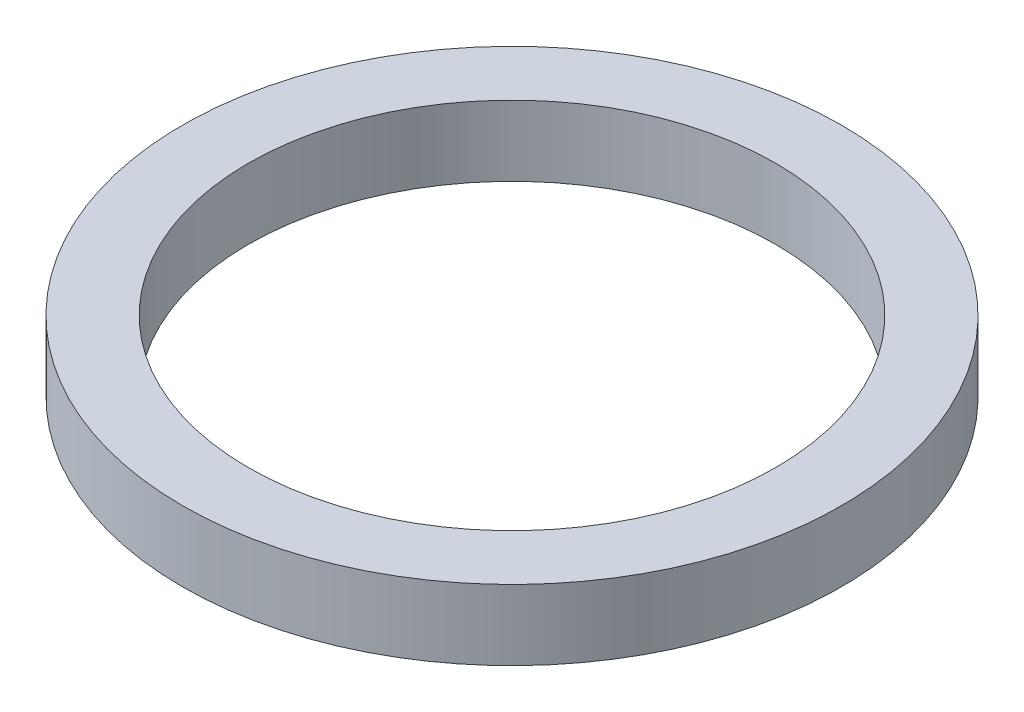
ISO-10303-21;
HEADER;
FILE_DESCRIPTION(('STEP AP214'),'2;1');
FILE_NAME('part.step','',(''),(''),'','','');
FILE_SCHEMA(('AUTOMOTIVE_DESIGN { 1 0 10303 214 1 1 1 1 }'));
ENDSEC;
DATA;
#1=APPLICATION_CONTEXT('core data for automotive mechanical design processes');
#2=APPLICATION_PROTOCOL_DEFINITION('international standard','automotive_design',2000,#1);
#3=PRODUCT_CONTEXT('',#1,'mechanical');
#4=PRODUCT('Part','Part','',(#3));
#5=PRODUCT_RELATED_PRODUCT_CATEGORY('part','',(#4));
#6=PRODUCT_DEFINITION_FORMATION('','',#4);
#7=PRODUCT_DEFINITION_CONTEXT('part definition',#1,'design');
#8=PRODUCT_DEFINITION('design','',#6,#7);
#9=PRODUCT_DEFINITION_SHAPE('','',#8);
#10=(LENGTH_UNIT() NAMED_UNIT(*) SI_UNIT(.MILLI.,.METRE.));
#11=(NAMED_UNIT(*) PLANE_ANGLE_UNIT() SI_UNIT($,.RADIAN.));
#12=(NAMED_UNIT(*) SI_UNIT($,.STERADIAN.) SOLID_ANGLE_UNIT());
#13=UNCERTAINTY_MEASURE_WITH_UNIT(LENGTH_MEASURE(1.E-05),#10,'distance_accuracy_value','');
#14=(GEOMETRIC_REPRESENTATION_CONTEXT(3) GLOBAL_UNCERTAINTY_ASSIGNED_CONTEXT((#13)) GLOBAL_UNIT_ASSIGNED_CONTEXT((#10,
#11,#12)) REPRESENTATION_CONTEXT('',''));
#15=CARTESIAN_POINT('',(0.,0.,0.));
#16=DIRECTION('',(0.,0.,1.));
#17=DIRECTION('',(1.,0.,0.));
#18=AXIS2_PLACEMENT_3D('',#15,#16,#17);
#19=CARTESIAN_POINT('',(0.,16.,0.));
#20=DIRECTION('',(0.,-1.,0.));
#21=DIRECTION('',(0.,0.,-1.));
#22=AXIS2_PLACEMENT_3D('',#19,#20,#21);
#23=CYLINDRICAL_SURFACE('',#22,75.);
#24=CARTESIAN_POINT('',(0.,16.,0.));
#25=DIRECTION('',(0.,1.,0.));
#26=DIRECTION('',(0.,0.,1.));
#27=AXIS2_PLACEMENT_3D('',#24,#25,#26);
#28=CIRCLE('',#27,75.);
#29=CARTESIAN_POINT('',(0.,16.,75.));
#30=VERTEX_POINT('',#29);
#31=EDGE_CURVE('E10',#30,#30,#28,.T.);
#32=ORIENTED_EDGE('',*,*,#31,.F.);
#33=EDGE_LOOP('',(#32));
#34=FACE_BOUND('',#33,.T.);
#35=CARTESIAN_POINT('',(0.,0.,0.));
#36=DIRECTION('',(0.,1.,0.));
#37=DIRECTION('',(0.,0.,1.));
#38=AXIS2_PLACEMENT_3D('',#35,#36,#37);
#39=CIRCLE('',#38,75.);
#40=CARTESIAN_POINT('',(0.,0.,75.));
#41=VERTEX_POINT('',#40);
#42=EDGE_CURVE('E43',#41,#41,#39,.T.);
#43=ORIENTED_EDGE('',*,*,#42,.T.);
#44=EDGE_LOOP('',(#43));
#45=FACE_BOUND('',#44,.T.);
#46=ADVANCED_FACE('F40',(#34,#45),#23,.T.);
#47=CARTESIAN_POINT('',(0.,16.,0.));
#48=DIRECTION('',(0.,1.,0.));
#49=DIRECTION('',(0.,0.,1.));
#50=AXIS2_PLACEMENT_3D('',#47,#48,#49);
#51=PLANE('',#50);
#52=CARTESIAN_POINT('',(0.,16.,0.));
#53=DIRECTION('',(0.,1.,0.));
#54=DIRECTION('',(0.,0.,1.));
#55=AXIS2_PLACEMENT_3D('',#52,#53,#54);
#56=CIRCLE('',#55,60.);
#57=CARTESIAN_POINT('',(0.,16.,60.));
#58=VERTEX_POINT('',#57);
#59=EDGE_CURVE('E50',#58,#58,#56,.F.);
#60=ORIENTED_EDGE('',*,*,#59,.T.);
#61=EDGE_LOOP('',(#60));
#62=FACE_BOUND('',#61,.T.);
#63=ORIENTED_EDGE('',*,*,#31,.T.);
#64=EDGE_LOOP('',(#63));
#65=FACE_BOUND('',#64,.T.);
#66=ADVANCED_FACE('F64',(#62,#65),#51,.T.);
#67=CARTESIAN_POINT('',(0.,0.,0.));
#68=DIRECTION('',(0.,1.,0.));
#69=DIRECTION('',(0.,0.,1.));
#70=AXIS2_PLACEMENT_3D('',#67,#68,#69);
#71=PLANE('',#70);
#72=CARTESIAN_POINT('',(0.,0.,0.));
#73=DIRECTION('',(0.,-1.,0.));
#74=DIRECTION('',(0.,0.,-1.));
#75=AXIS2_PLACEMENT_3D('',#72,#73,#74);
#76=CIRCLE('',#75,60.);
#77=CARTESIAN_POINT('',(0.,0.,-60.));
#78=VERTEX_POINT('',#77);
#79=EDGE_CURVE('E54',#78,#78,#76,.T.);
#80=ORIENTED_EDGE('',*,*,#79,.F.);
#81=EDGE_LOOP('',(#80));
#82=FACE_BOUND('',#81,.T.);
#83=ORIENTED_EDGE('',*,*,#42,.F.);
#84=EDGE_LOOP('',(#83));
#85=FACE_BOUND('',#84,.T.);
#86=ADVANCED_FACE('F61',(#82,#85),#71,.F.);
#87=CARTESIAN_POINT('',(0.,185.705627484771,0.));
#88=DIRECTION('',(0.,-1.,0.));
#89=DIRECTION('',(0.,0.,-1.));
#90=AXIS2_PLACEMENT_3D('',#87,#88,#89);
#91=CYLINDRICAL_SURFACE('',#90,60.);
#92=ORIENTED_EDGE('',*,*,#79,.T.);
#93=EDGE_LOOP('',(#92));
#94=FACE_BOUND('',#93,.T.);
#95=ORIENTED_EDGE('',*,*,#59,.F.);
#96=EDGE_LOOP('',(#95));
#97=FACE_BOUND('',#96,.T.);
#98=ADVANCED_FACE('F58',(#94,#97),#91,.F.);
#99=CLOSED_SHELL('',(#46,#66,#86,#98));
#100=MANIFOLD_SOLID_BREP('B2',#99);
#101=ADVANCED_BREP_SHAPE_REPRESENTATION('',(#18,#100),#14);
#102=SHAPE_DEFINITION_REPRESENTATION(#9,#101);
ENDSEC;
END-ISO-10303-21;
